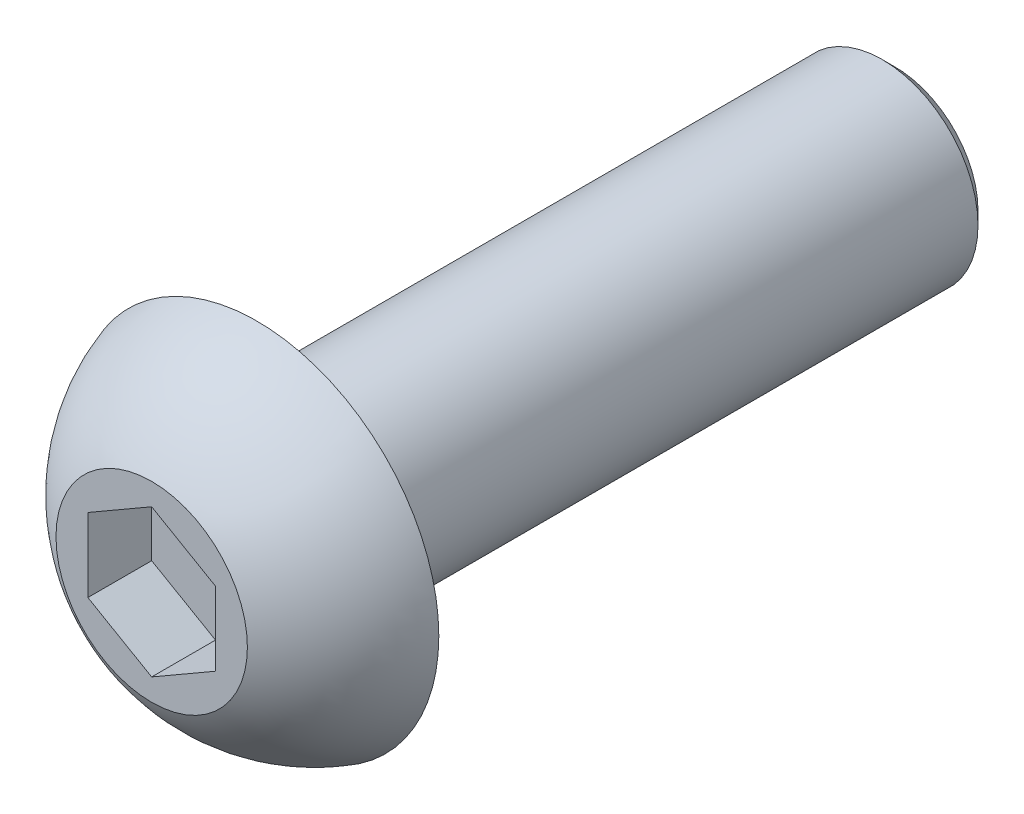
ISO-10303-21;
HEADER;
FILE_DESCRIPTION(('STEP AP214'),'2;1');
FILE_NAME('part.step','',(''),(''),'','','');
FILE_SCHEMA(('AUTOMOTIVE_DESIGN { 1 0 10303 214 1 1 1 1 }'));
ENDSEC;
DATA;
#1=APPLICATION_CONTEXT('core data for automotive mechanical design processes');
#2=APPLICATION_PROTOCOL_DEFINITION('international standard','automotive_design',2000,#1);
#3=PRODUCT_CONTEXT('',#1,'mechanical');
#4=PRODUCT('Part','Part','',(#3));
#5=PRODUCT_RELATED_PRODUCT_CATEGORY('part','',(#4));
#6=PRODUCT_DEFINITION_FORMATION('','',#4);
#7=PRODUCT_DEFINITION_CONTEXT('part definition',#1,'design');
#8=PRODUCT_DEFINITION('design','',#6,#7);
#9=PRODUCT_DEFINITION_SHAPE('','',#8);
#10=(LENGTH_UNIT() NAMED_UNIT(*) SI_UNIT(.MILLI.,.METRE.));
#11=(NAMED_UNIT(*) PLANE_ANGLE_UNIT() SI_UNIT($,.RADIAN.));
#12=(NAMED_UNIT(*) SI_UNIT($,.STERADIAN.) SOLID_ANGLE_UNIT());
#13=UNCERTAINTY_MEASURE_WITH_UNIT(LENGTH_MEASURE(1.E-05),#10,'distance_accuracy_value','');
#14=(GEOMETRIC_REPRESENTATION_CONTEXT(3) GLOBAL_UNCERTAINTY_ASSIGNED_CONTEXT((#13)) GLOBAL_UNIT_ASSIGNED_CONTEXT((#10,
#11,#12)) REPRESENTATION_CONTEXT('',''));
#15=CARTESIAN_POINT('',(0.,0.,0.));
#16=DIRECTION('',(0.,0.,1.));
#17=DIRECTION('',(1.,0.,0.));
#18=AXIS2_PLACEMENT_3D('',#15,#16,#17);
#19=CARTESIAN_POINT('',(0.,0.,-0.848743432909573));
#20=DIRECTION('',(0.,0.,1.));
#21=DIRECTION('',(1.,0.,0.));
#22=AXIS2_PLACEMENT_3D('',#19,#20,#21);
#23=DEGENERATE_TOROIDAL_SURFACE('',#22,0.129313581999413,2.85,.T.);
#24=CARTESIAN_POINT('',(0.,0.,1.65));
#25=DIRECTION('',(0.,0.,1.));
#26=DIRECTION('',(1.,0.,0.));
#27=AXIS2_PLACEMENT_3D('',#24,#25,#26);
#28=CIRCLE('',#27,1.5);
#29=CARTESIAN_POINT('',(1.5,0.,1.65));
#30=VERTEX_POINT('',#29);
#31=EDGE_CURVE('E148',#30,#30,#28,.T.);
#32=ORIENTED_EDGE('',*,*,#31,.F.);
#33=EDGE_LOOP('',(#32));
#34=FACE_BOUND('',#33,.T.);
#35=CARTESIAN_POINT('',(0.,0.,0.));
#36=DIRECTION('',(0.,0.,1.));
#37=DIRECTION('',(1.,0.,0.));
#38=AXIS2_PLACEMENT_3D('',#35,#36,#37);
#39=CIRCLE('',#38,2.85);
#40=CARTESIAN_POINT('',(2.85,0.,0.));
#41=VERTEX_POINT('',#40);
#42=EDGE_CURVE('E137',#41,#41,#39,.T.);
#43=ORIENTED_EDGE('',*,*,#42,.T.);
#44=EDGE_LOOP('',(#43));
#45=FACE_BOUND('',#44,.T.);
#46=ADVANCED_FACE('F35',(#34,#45),#23,.T.);
#47=CARTESIAN_POINT('',(0.,0.,1.65));
#48=DIRECTION('',(0.,0.,-1.));
#49=DIRECTION('',(-1.,0.,0.));
#50=AXIS2_PLACEMENT_3D('',#47,#48,#49);
#51=PLANE('',#50);
#52=DIRECTION('',(-0.866025403784439,-0.5,0.));
#53=VECTOR('',#52,1.);
#54=CARTESIAN_POINT('',(0.,1.15470053837925,1.65));
#55=LINE('',#54,#53);
#56=CARTESIAN_POINT('',(0.,1.15470053837925,1.65));
#57=VERTEX_POINT('',#56);
#58=CARTESIAN_POINT('',(-1.,0.577350269189626,1.65));
#59=VERTEX_POINT('',#58);
#60=EDGE_CURVE('E124',#57,#59,#55,.T.);
#61=ORIENTED_EDGE('',*,*,#60,.F.);
#62=DIRECTION('',(-0.866025403784439,0.5,0.));
#63=VECTOR('',#62,1.);
#64=CARTESIAN_POINT('',(1.,0.577350269189626,1.65));
#65=LINE('',#64,#63);
#66=CARTESIAN_POINT('',(1.,0.577350269189626,1.65));
#67=VERTEX_POINT('',#66);
#68=EDGE_CURVE('E50',#67,#57,#65,.T.);
#69=ORIENTED_EDGE('',*,*,#68,.F.);
#70=DIRECTION('',(0.,1.,0.));
#71=VECTOR('',#70,1.);
#72=CARTESIAN_POINT('',(1.,-0.577350269189626,1.65));
#73=LINE('',#72,#71);
#74=CARTESIAN_POINT('',(1.,-0.577350269189626,1.65));
#75=VERTEX_POINT('',#74);
#76=EDGE_CURVE('E133',#75,#67,#73,.T.);
#77=ORIENTED_EDGE('',*,*,#76,.F.);
#78=DIRECTION('',(0.866025403784439,0.5,0.));
#79=VECTOR('',#78,1.);
#80=CARTESIAN_POINT('',(0.,-1.15470053837925,1.65));
#81=LINE('',#80,#79);
#82=CARTESIAN_POINT('',(0.,-1.15470053837925,1.65));
#83=VERTEX_POINT('',#82);
#84=EDGE_CURVE('E131',#83,#75,#81,.T.);
#85=ORIENTED_EDGE('',*,*,#84,.F.);
#86=DIRECTION('',(0.866025403784439,-0.5,0.));
#87=VECTOR('',#86,1.);
#88=CARTESIAN_POINT('',(-1.,-0.577350269189626,1.65));
#89=LINE('',#88,#87);
#90=CARTESIAN_POINT('',(-1.,-0.577350269189626,1.65));
#91=VERTEX_POINT('',#90);
#92=EDGE_CURVE('E98',#91,#83,#89,.T.);
#93=ORIENTED_EDGE('',*,*,#92,.F.);
#94=DIRECTION('',(0.,-1.,0.));
#95=VECTOR('',#94,1.);
#96=CARTESIAN_POINT('',(-1.,0.577350269189626,1.65));
#97=LINE('',#96,#95);
#98=EDGE_CURVE('E127',#59,#91,#97,.T.);
#99=ORIENTED_EDGE('',*,*,#98,.F.);
#100=EDGE_LOOP('',(#61,#69,#77,#85,#93,#99));
#101=FACE_BOUND('',#100,.T.);
#102=ORIENTED_EDGE('',*,*,#31,.T.);
#103=EDGE_LOOP('',(#102));
#104=FACE_BOUND('',#103,.T.);
#105=ADVANCED_FACE('F165',(#101,#104),#51,.F.);
#106=CARTESIAN_POINT('',(0.,1.5,-10.));
#107=DIRECTION('',(0.,0.,1.));
#108=DIRECTION('',(1.,0.,0.));
#109=AXIS2_PLACEMENT_3D('',#106,#107,#108);
#110=PLANE('',#109);
#111=CARTESIAN_POINT('',(0.,0.,-10.));
#112=DIRECTION('',(0.,0.,1.));
#113=DIRECTION('',(1.,0.,0.));
#114=AXIS2_PLACEMENT_3D('',#111,#112,#113);
#115=CIRCLE('',#114,1.3);
#116=CARTESIAN_POINT('',(1.3,0.,-10.));
#117=VERTEX_POINT('',#116);
#118=EDGE_CURVE('E11',#117,#117,#115,.F.);
#119=ORIENTED_EDGE('',*,*,#118,.T.);
#120=EDGE_LOOP('',(#119));
#121=FACE_BOUND('',#120,.T.);
#122=ADVANCED_FACE('F170',(#121),#110,.F.);
#123=CARTESIAN_POINT('',(0.,0.,-10.));
#124=DIRECTION('',(0.,0.,1.));
#125=DIRECTION('',(1.,0.,0.));
#126=AXIS2_PLACEMENT_3D('',#123,#124,#125);
#127=CYLINDRICAL_SURFACE('',#126,1.5);
#128=CARTESIAN_POINT('',(0.,0.,-9.8));
#129=DIRECTION('',(0.,0.,1.));
#130=DIRECTION('',(1.,0.,0.));
#131=AXIS2_PLACEMENT_3D('',#128,#129,#130);
#132=CIRCLE('',#131,1.5);
#133=CARTESIAN_POINT('',(1.5,0.,-9.8));
#134=VERTEX_POINT('',#133);
#135=EDGE_CURVE('E43',#134,#134,#132,.T.);
#136=ORIENTED_EDGE('',*,*,#135,.T.);
#137=EDGE_LOOP('',(#136));
#138=FACE_BOUND('',#137,.T.);
#139=CARTESIAN_POINT('',(0.,0.,0.));
#140=DIRECTION('',(0.,0.,1.));
#141=DIRECTION('',(1.,0.,0.));
#142=AXIS2_PLACEMENT_3D('',#139,#140,#141);
#143=CIRCLE('',#142,1.5);
#144=CARTESIAN_POINT('',(1.5,0.,0.));
#145=VERTEX_POINT('',#144);
#146=EDGE_CURVE('E145',#145,#145,#143,.T.);
#147=ORIENTED_EDGE('',*,*,#146,.F.);
#148=EDGE_LOOP('',(#147));
#149=FACE_BOUND('',#148,.T.);
#150=ADVANCED_FACE('F153',(#138,#149),#127,.T.);
#151=CARTESIAN_POINT('',(0.,2.85,0.));
#152=DIRECTION('',(0.,0.,1.));
#153=DIRECTION('',(1.,0.,0.));
#154=AXIS2_PLACEMENT_3D('',#151,#152,#153);
#155=PLANE('',#154);
#156=ORIENTED_EDGE('',*,*,#42,.F.);
#157=EDGE_LOOP('',(#156));
#158=FACE_BOUND('',#157,.T.);
#159=ORIENTED_EDGE('',*,*,#146,.T.);
#160=EDGE_LOOP('',(#159));
#161=FACE_BOUND('',#160,.T.);
#162=ADVANCED_FACE('F181',(#158,#161),#155,.F.);
#163=CARTESIAN_POINT('',(1.,0.577350269189626,0.65));
#164=DIRECTION('',(0.5,0.866025403784439,0.));
#165=DIRECTION('',(-0.866025403784439,0.5,0.));
#166=AXIS2_PLACEMENT_3D('',#163,#164,#165);
#167=PLANE('',#166);
#168=ORIENTED_EDGE('',*,*,#68,.T.);
#169=DIRECTION('',(0.,0.,1.));
#170=VECTOR('',#169,1.);
#171=CARTESIAN_POINT('',(0.,1.15470053837925,0.65));
#172=LINE('',#171,#170);
#173=CARTESIAN_POINT('',(0.,1.15470053837925,0.65));
#174=VERTEX_POINT('',#173);
#175=EDGE_CURVE('E80',#174,#57,#172,.T.);
#176=ORIENTED_EDGE('',*,*,#175,.F.);
#177=DIRECTION('',(-0.866025403784439,0.5,0.));
#178=VECTOR('',#177,1.);
#179=CARTESIAN_POINT('',(1.,0.577350269189626,0.65));
#180=LINE('',#179,#178);
#181=CARTESIAN_POINT('',(1.,0.577350269189626,0.65));
#182=VERTEX_POINT('',#181);
#183=EDGE_CURVE('E135',#182,#174,#180,.T.);
#184=ORIENTED_EDGE('',*,*,#183,.F.);
#185=DIRECTION('',(0.,0.,1.));
#186=VECTOR('',#185,1.);
#187=CARTESIAN_POINT('',(1.,0.577350269189626,0.65));
#188=LINE('',#187,#186);
#189=EDGE_CURVE('E58',#182,#67,#188,.T.);
#190=ORIENTED_EDGE('',*,*,#189,.T.);
#191=EDGE_LOOP('',(#168,#176,#184,#190));
#192=FACE_BOUND('',#191,.T.);
#193=ADVANCED_FACE('F184',(#192),#167,.F.);
#194=CARTESIAN_POINT('',(1.,-0.577350269189626,0.65));
#195=DIRECTION('',(1.,0.,0.));
#196=DIRECTION('',(0.,1.,0.));
#197=AXIS2_PLACEMENT_3D('',#194,#195,#196);
#198=PLANE('',#197);
#199=ORIENTED_EDGE('',*,*,#76,.T.);
#200=ORIENTED_EDGE('',*,*,#189,.F.);
#201=DIRECTION('',(0.,1.,0.));
#202=VECTOR('',#201,1.);
#203=CARTESIAN_POINT('',(1.,-0.577350269189626,0.65));
#204=LINE('',#203,#202);
#205=CARTESIAN_POINT('',(1.,-0.577350269189626,0.65));
#206=VERTEX_POINT('',#205);
#207=EDGE_CURVE('E110',#206,#182,#204,.T.);
#208=ORIENTED_EDGE('',*,*,#207,.F.);
#209=DIRECTION('',(0.,0.,1.));
#210=VECTOR('',#209,1.);
#211=CARTESIAN_POINT('',(1.,-0.577350269189626,0.65));
#212=LINE('',#211,#210);
#213=EDGE_CURVE('E102',#206,#75,#212,.T.);
#214=ORIENTED_EDGE('',*,*,#213,.T.);
#215=EDGE_LOOP('',(#199,#200,#208,#214));
#216=FACE_BOUND('',#215,.T.);
#217=ADVANCED_FACE('F188',(#216),#198,.F.);
#218=CARTESIAN_POINT('',(0.,-1.15470053837925,0.65));
#219=DIRECTION('',(0.5,-0.866025403784439,0.));
#220=DIRECTION('',(0.866025403784439,0.5,0.));
#221=AXIS2_PLACEMENT_3D('',#218,#219,#220);
#222=PLANE('',#221);
#223=ORIENTED_EDGE('',*,*,#84,.T.);
#224=ORIENTED_EDGE('',*,*,#213,.F.);
#225=DIRECTION('',(0.866025403784439,0.5,0.));
#226=VECTOR('',#225,1.);
#227=CARTESIAN_POINT('',(0.,-1.15470053837925,0.65));
#228=LINE('',#227,#226);
#229=CARTESIAN_POINT('',(0.,-1.15470053837925,0.65));
#230=VERTEX_POINT('',#229);
#231=EDGE_CURVE('E106',#230,#206,#228,.T.);
#232=ORIENTED_EDGE('',*,*,#231,.F.);
#233=DIRECTION('',(0.,0.,1.));
#234=VECTOR('',#233,1.);
#235=CARTESIAN_POINT('',(0.,-1.15470053837925,0.65));
#236=LINE('',#235,#234);
#237=EDGE_CURVE('E91',#230,#83,#236,.T.);
#238=ORIENTED_EDGE('',*,*,#237,.T.);
#239=EDGE_LOOP('',(#223,#224,#232,#238));
#240=FACE_BOUND('',#239,.T.);
#241=ADVANCED_FACE('F107',(#240),#222,.F.);
#242=CARTESIAN_POINT('',(-1.,-0.577350269189626,0.65));
#243=DIRECTION('',(-0.5,-0.866025403784439,0.));
#244=DIRECTION('',(0.866025403784439,-0.5,0.));
#245=AXIS2_PLACEMENT_3D('',#242,#243,#244);
#246=PLANE('',#245);
#247=ORIENTED_EDGE('',*,*,#92,.T.);
#248=ORIENTED_EDGE('',*,*,#237,.F.);
#249=DIRECTION('',(0.866025403784439,-0.5,0.));
#250=VECTOR('',#249,1.);
#251=CARTESIAN_POINT('',(-1.,-0.577350269189626,0.65));
#252=LINE('',#251,#250);
#253=CARTESIAN_POINT('',(-1.,-0.577350269189626,0.65));
#254=VERTEX_POINT('',#253);
#255=EDGE_CURVE('E95',#254,#230,#252,.T.);
#256=ORIENTED_EDGE('',*,*,#255,.F.);
#257=DIRECTION('',(0.,0.,1.));
#258=VECTOR('',#257,1.);
#259=CARTESIAN_POINT('',(-1.,-0.577350269189626,0.65));
#260=LINE('',#259,#258);
#261=EDGE_CURVE('E103',#254,#91,#260,.T.);
#262=ORIENTED_EDGE('',*,*,#261,.T.);
#263=EDGE_LOOP('',(#247,#248,#256,#262));
#264=FACE_BOUND('',#263,.T.);
#265=ADVANCED_FACE('F93',(#264),#246,.F.);
#266=CARTESIAN_POINT('',(-1.,0.577350269189626,0.65));
#267=DIRECTION('',(-1.,0.,0.));
#268=DIRECTION('',(0.,0.,1.));
#269=AXIS2_PLACEMENT_3D('',#266,#267,#268);
#270=PLANE('',#269);
#271=ORIENTED_EDGE('',*,*,#98,.T.);
#272=ORIENTED_EDGE('',*,*,#261,.F.);
#273=DIRECTION('',(0.,-1.,0.));
#274=VECTOR('',#273,1.);
#275=CARTESIAN_POINT('',(-1.,0.577350269189626,0.65));
#276=LINE('',#275,#274);
#277=CARTESIAN_POINT('',(-1.,0.577350269189626,0.65));
#278=VERTEX_POINT('',#277);
#279=EDGE_CURVE('E116',#278,#254,#276,.T.);
#280=ORIENTED_EDGE('',*,*,#279,.F.);
#281=DIRECTION('',(0.,0.,1.));
#282=VECTOR('',#281,1.);
#283=CARTESIAN_POINT('',(-1.,0.577350269189626,0.65));
#284=LINE('',#283,#282);
#285=EDGE_CURVE('E140',#278,#59,#284,.T.);
#286=ORIENTED_EDGE('',*,*,#285,.T.);
#287=EDGE_LOOP('',(#271,#272,#280,#286));
#288=FACE_BOUND('',#287,.T.);
#289=ADVANCED_FACE('F191',(#288),#270,.F.);
#290=CARTESIAN_POINT('',(0.,1.15470053837925,0.65));
#291=DIRECTION('',(-0.5,0.866025403784438,0.));
#292=DIRECTION('',(-0.866025403784439,-0.5,0.));
#293=AXIS2_PLACEMENT_3D('',#290,#291,#292);
#294=PLANE('',#293);
#295=ORIENTED_EDGE('',*,*,#60,.T.);
#296=ORIENTED_EDGE('',*,*,#285,.F.);
#297=DIRECTION('',(-0.866025403784439,-0.5,0.));
#298=VECTOR('',#297,1.);
#299=CARTESIAN_POINT('',(0.,1.15470053837925,0.65));
#300=LINE('',#299,#298);
#301=EDGE_CURVE('E118',#174,#278,#300,.T.);
#302=ORIENTED_EDGE('',*,*,#301,.F.);
#303=ORIENTED_EDGE('',*,*,#175,.T.);
#304=EDGE_LOOP('',(#295,#296,#302,#303));
#305=FACE_BOUND('',#304,.T.);
#306=ADVANCED_FACE('F161',(#305),#294,.F.);
#307=CARTESIAN_POINT('',(0.,0.,0.65));
#308=DIRECTION('',(0.,0.,1.));
#309=DIRECTION('',(1.,0.,0.));
#310=AXIS2_PLACEMENT_3D('',#307,#308,#309);
#311=PLANE('',#310);
#312=ORIENTED_EDGE('',*,*,#183,.T.);
#313=ORIENTED_EDGE('',*,*,#301,.T.);
#314=ORIENTED_EDGE('',*,*,#279,.T.);
#315=ORIENTED_EDGE('',*,*,#255,.T.);
#316=ORIENTED_EDGE('',*,*,#231,.T.);
#317=ORIENTED_EDGE('',*,*,#207,.T.);
#318=EDGE_LOOP('',(#312,#313,#314,#315,#316,#317));
#319=FACE_BOUND('',#318,.T.);
#320=ADVANCED_FACE('F113',(#319),#311,.T.);
#321=CARTESIAN_POINT('',(0.,0.,-9.8));
#322=DIRECTION('',(0.,0.,1.));
#323=DIRECTION('',(1.,0.,0.));
#324=AXIS2_PLACEMENT_3D('',#321,#322,#323);
#325=CONICAL_SURFACE('',#324,1.5,0.78539816339745);
#326=ORIENTED_EDGE('',*,*,#118,.F.);
#327=EDGE_LOOP('',(#326));
#328=FACE_BOUND('',#327,.T.);
#329=ORIENTED_EDGE('',*,*,#135,.F.);
#330=EDGE_LOOP('',(#329));
#331=FACE_BOUND('',#330,.T.);
#332=ADVANCED_FACE('F37',(#328,#331),#325,.T.);
#333=CLOSED_SHELL('',(#46,#105,#122,#150,#162,#193,#217,#241,#265,#289,#306,#320,#332));
#334=MANIFOLD_SOLID_BREP('B2',#333);
#335=ADVANCED_BREP_SHAPE_REPRESENTATION('',(#18,#334),#14);
#336=SHAPE_DEFINITION_REPRESENTATION(#9,#335);
ENDSEC;
END-ISO-10303-21;
